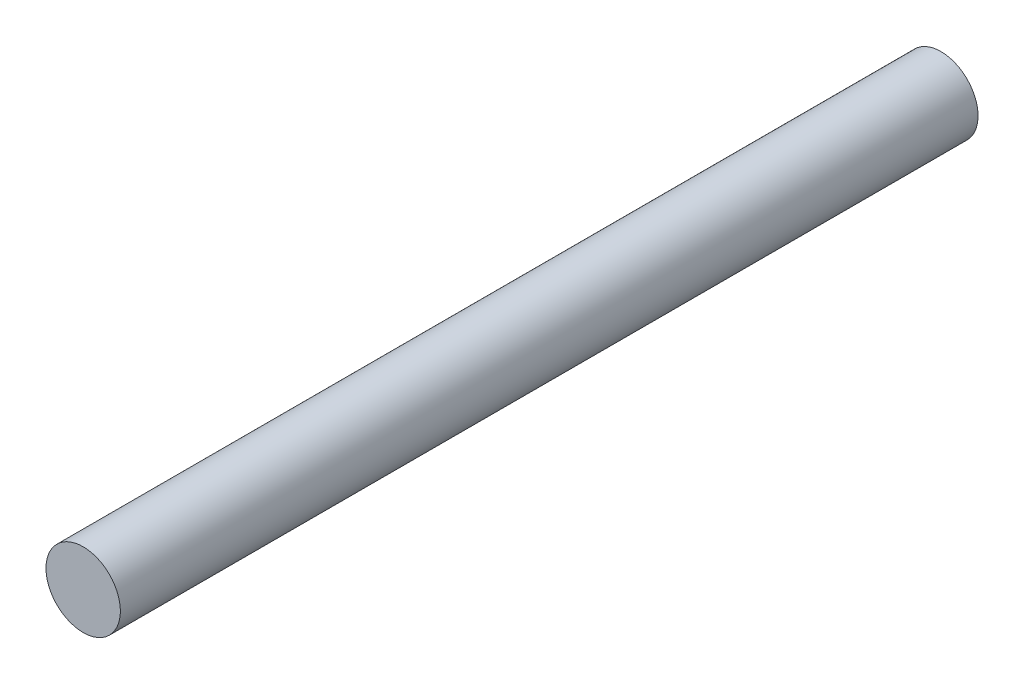
ISO-10303-21;
HEADER;
FILE_DESCRIPTION(('STEP AP214'),'2;1');
FILE_NAME('part.step','',(''),(''),'','','');
FILE_SCHEMA(('AUTOMOTIVE_DESIGN { 1 0 10303 214 1 1 1 1 }'));
ENDSEC;
DATA;
#1=APPLICATION_CONTEXT('core data for automotive mechanical design processes');
#2=APPLICATION_PROTOCOL_DEFINITION('international standard','automotive_design',2000,#1);
#3=PRODUCT_CONTEXT('',#1,'mechanical');
#4=PRODUCT('Part','Part','',(#3));
#5=PRODUCT_RELATED_PRODUCT_CATEGORY('part','',(#4));
#6=PRODUCT_DEFINITION_FORMATION('','',#4);
#7=PRODUCT_DEFINITION_CONTEXT('part definition',#1,'design');
#8=PRODUCT_DEFINITION('design','',#6,#7);
#9=PRODUCT_DEFINITION_SHAPE('','',#8);
#10=(LENGTH_UNIT() NAMED_UNIT(*) SI_UNIT(.MILLI.,.METRE.));
#11=(NAMED_UNIT(*) PLANE_ANGLE_UNIT() SI_UNIT($,.RADIAN.));
#12=(NAMED_UNIT(*) SI_UNIT($,.STERADIAN.) SOLID_ANGLE_UNIT());
#13=UNCERTAINTY_MEASURE_WITH_UNIT(LENGTH_MEASURE(1.E-05),#10,'distance_accuracy_value','');
#14=(GEOMETRIC_REPRESENTATION_CONTEXT(3) GLOBAL_UNCERTAINTY_ASSIGNED_CONTEXT((#13)) GLOBAL_UNIT_ASSIGNED_CONTEXT((#10,
#11,#12)) REPRESENTATION_CONTEXT('',''));
#15=CARTESIAN_POINT('',(0.,0.,0.));
#16=DIRECTION('',(0.,0.,1.));
#17=DIRECTION('',(1.,0.,0.));
#18=AXIS2_PLACEMENT_3D('',#15,#16,#17);
#19=CARTESIAN_POINT('',(0.,0.,90.));
#20=DIRECTION('',(0.,0.,-1.));
#21=DIRECTION('',(-1.,0.,0.));
#22=AXIS2_PLACEMENT_3D('',#19,#20,#21);
#23=CYLINDRICAL_SURFACE('',#22,3.9);
#24=CARTESIAN_POINT('',(0.,0.,90.));
#25=DIRECTION('',(0.,0.,1.));
#26=DIRECTION('',(1.,0.,0.));
#27=AXIS2_PLACEMENT_3D('',#24,#25,#26);
#28=CIRCLE('',#27,3.9);
#29=CARTESIAN_POINT('',(-3.9,0.,90.));
#30=VERTEX_POINT('',#29);
#31=EDGE_CURVE('E10',#30,#30,#28,.T.);
#32=CARTESIAN_POINT('',(0.,0.,0.));
#33=DIRECTION('',(0.,0.,1.));
#34=DIRECTION('',(1.,0.,0.));
#35=AXIS2_PLACEMENT_3D('',#32,#33,#34);
#36=CIRCLE('',#35,3.9);
#37=CARTESIAN_POINT('',(-3.9,0.,0.));
#38=VERTEX_POINT('',#37);
#39=EDGE_CURVE('E37',#38,#38,#36,.T.);
#40=CARTESIAN_POINT('',(-3.9,0.,90.));
#41=CARTESIAN_POINT('',(-3.9,0.,89.0625));
#42=CARTESIAN_POINT('',(-3.9,0.,88.125));
#43=CARTESIAN_POINT('',(-3.9,0.,86.25));
#44=CARTESIAN_POINT('',(-3.9,0.,85.3125));
#45=CARTESIAN_POINT('',(-3.9,0.,83.4375));
#46=CARTESIAN_POINT('',(-3.9,0.,82.5));
#47=CARTESIAN_POINT('',(-3.9,0.,80.625));
#48=CARTESIAN_POINT('',(-3.9,0.,79.6875));
#49=CARTESIAN_POINT('',(-3.9,0.,77.8125));
#50=CARTESIAN_POINT('',(-3.9,0.,76.875));
#51=CARTESIAN_POINT('',(-3.9,0.,75.));
#52=CARTESIAN_POINT('',(-3.9,0.,74.0625));
#53=CARTESIAN_POINT('',(-3.9,0.,72.1875));
#54=CARTESIAN_POINT('',(-3.9,0.,71.25));
#55=CARTESIAN_POINT('',(-3.9,0.,69.375));
#56=CARTESIAN_POINT('',(-3.9,0.,68.4375));
#57=CARTESIAN_POINT('',(-3.9,0.,66.5625));
#58=CARTESIAN_POINT('',(-3.9,0.,65.625));
#59=CARTESIAN_POINT('',(-3.9,0.,63.75));
#60=CARTESIAN_POINT('',(-3.9,0.,62.8125));
#61=CARTESIAN_POINT('',(-3.9,0.,60.9375));
#62=CARTESIAN_POINT('',(-3.9,0.,60.));
#63=CARTESIAN_POINT('',(-3.9,0.,58.125));
#64=CARTESIAN_POINT('',(-3.9,0.,57.1875));
#65=CARTESIAN_POINT('',(-3.9,0.,55.3125));
#66=CARTESIAN_POINT('',(-3.9,0.,54.375));
#67=CARTESIAN_POINT('',(-3.9,0.,52.5));
#68=CARTESIAN_POINT('',(-3.9,0.,51.5625));
#69=CARTESIAN_POINT('',(-3.9,0.,49.6875));
#70=CARTESIAN_POINT('',(-3.9,0.,48.75));
#71=CARTESIAN_POINT('',(-3.9,0.,46.875));
#72=CARTESIAN_POINT('',(-3.9,0.,45.9375));
#73=CARTESIAN_POINT('',(-3.9,0.,44.0625));
#74=CARTESIAN_POINT('',(-3.9,0.,43.125));
#75=CARTESIAN_POINT('',(-3.9,0.,41.25));
#76=CARTESIAN_POINT('',(-3.9,0.,40.3125));
#77=CARTESIAN_POINT('',(-3.9,0.,38.4375));
#78=CARTESIAN_POINT('',(-3.9,0.,37.5));
#79=CARTESIAN_POINT('',(-3.9,0.,35.625));
#80=CARTESIAN_POINT('',(-3.9,0.,34.6875));
#81=CARTESIAN_POINT('',(-3.9,0.,32.8125));
#82=CARTESIAN_POINT('',(-3.9,0.,31.875));
#83=CARTESIAN_POINT('',(-3.9,0.,30.));
#84=CARTESIAN_POINT('',(-3.9,0.,29.0625));
#85=CARTESIAN_POINT('',(-3.9,0.,27.1875));
#86=CARTESIAN_POINT('',(-3.9,0.,26.25));
#87=CARTESIAN_POINT('',(-3.9,0.,24.375));
#88=CARTESIAN_POINT('',(-3.9,0.,23.4375));
#89=CARTESIAN_POINT('',(-3.9,0.,21.5625));
#90=CARTESIAN_POINT('',(-3.9,0.,20.625));
#91=CARTESIAN_POINT('',(-3.9,0.,18.75));
#92=CARTESIAN_POINT('',(-3.9,0.,17.8125));
#93=CARTESIAN_POINT('',(-3.9,0.,15.9375));
#94=CARTESIAN_POINT('',(-3.9,0.,15.));
#95=CARTESIAN_POINT('',(-3.9,0.,13.125));
#96=CARTESIAN_POINT('',(-3.9,0.,12.1875));
#97=CARTESIAN_POINT('',(-3.9,0.,10.3125));
#98=CARTESIAN_POINT('',(-3.9,0.,9.37499999999999));
#99=CARTESIAN_POINT('',(-3.9,0.,7.49999999999999));
#100=CARTESIAN_POINT('',(-3.9,0.,6.56249999999999));
#101=CARTESIAN_POINT('',(-3.9,0.,4.68749999999999));
#102=CARTESIAN_POINT('',(-3.9,0.,3.74999999999998));
#103=CARTESIAN_POINT('',(-3.9,0.,1.87499999999998));
#104=CARTESIAN_POINT('',(-3.9,0.,0.937499999999986));
#105=CARTESIAN_POINT('',(-3.9,0.,0.));
#106=B_SPLINE_CURVE_WITH_KNOTS('',3,(#40,#41,#42,#43,#44,#45,#46,#47,#48,#49,#50,#51,#52,#53,
#54,#55,#56,#57,#58,#59,#60,#61,#62,#63,#64,#65,#66,#67,#68,#69,#70,#71,#72,#73,#74,#75,#76,#77,
#78,#79,#80,#81,#82,#83,#84,#85,#86,#87,#88,#89,#90,#91,#92,#93,#94,#95,#96,#97,#98,#99,#100,
#101,#102,#103,#104,#105),.UNSPECIFIED.,.F.,.F.,(4,2,2,2,2,2,2,2,2,2,2,2,2,2,2,2,2,2,2,2,2,2,2,
2,2,2,2,2,2,2,2,2,4),(0.,2.8125,5.62499999999999,8.43749999999999,11.25,14.0625,16.875,19.6875,
22.5,25.3125,28.125,30.9375,33.75,36.5625,39.375,42.1875,45.,47.8125,50.625,53.4375,56.25,
59.0625,61.875,64.6875,67.5,70.3125,73.125,75.9375,78.75,81.5625,84.375,87.1875,90.),.UNSPECIFIED.);
#107=EDGE_CURVE('BSEAM34',#30,#38,#106,.T.);
#108=ORIENTED_EDGE('',*,*,#31,.F.);
#109=ORIENTED_EDGE('',*,*,#39,.T.);
#110=ORIENTED_EDGE('',*,*,#107,.T.);
#111=ORIENTED_EDGE('',*,*,#107,.F.);
#112=EDGE_LOOP('',(#108,#110,#109,#111));
#113=FACE_BOUND('',#112,.T.);
#114=ADVANCED_FACE('F34',(#113),#23,.T.);
#115=CARTESIAN_POINT('',(0.,0.,90.));
#116=DIRECTION('',(0.,0.,1.));
#117=DIRECTION('',(1.,0.,0.));
#118=AXIS2_PLACEMENT_3D('',#115,#116,#117);
#119=PLANE('',#118);
#120=ORIENTED_EDGE('',*,*,#31,.T.);
#121=EDGE_LOOP('',(#120));
#122=FACE_BOUND('',#121,.T.);
#123=ADVANCED_FACE('F49',(#122),#119,.T.);
#124=CARTESIAN_POINT('',(0.,0.,0.));
#125=DIRECTION('',(0.,0.,1.));
#126=DIRECTION('',(1.,0.,0.));
#127=AXIS2_PLACEMENT_3D('',#124,#125,#126);
#128=PLANE('',#127);
#129=ORIENTED_EDGE('',*,*,#39,.F.);
#130=EDGE_LOOP('',(#129));
#131=FACE_BOUND('',#130,.T.);
#132=ADVANCED_FACE('F47',(#131),#128,.F.);
#133=CLOSED_SHELL('',(#114,#123,#132));
#134=MANIFOLD_SOLID_BREP('B2',#133);
#135=ADVANCED_BREP_SHAPE_REPRESENTATION('',(#18,#134),#14);
#136=SHAPE_DEFINITION_REPRESENTATION(#9,#135);
ENDSEC;
END-ISO-10303-21;
